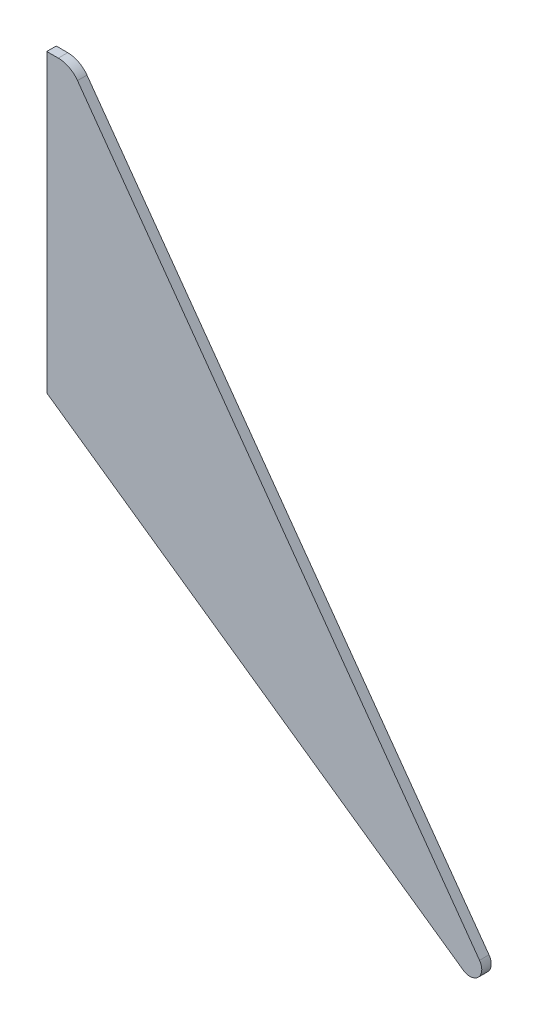
ISO-10303-21;
HEADER;
FILE_DESCRIPTION(('STEP AP214'),'2;1');
FILE_NAME('part.step','',(''),(''),'','','');
FILE_SCHEMA(('AUTOMOTIVE_DESIGN { 1 0 10303 214 1 1 1 1 }'));
ENDSEC;
DATA;
#1=APPLICATION_CONTEXT('core data for automotive mechanical design processes');
#2=APPLICATION_PROTOCOL_DEFINITION('international standard','automotive_design',2000,#1);
#3=PRODUCT_CONTEXT('',#1,'mechanical');
#4=PRODUCT('Part','Part','',(#3));
#5=PRODUCT_RELATED_PRODUCT_CATEGORY('part','',(#4));
#6=PRODUCT_DEFINITION_FORMATION('','',#4);
#7=PRODUCT_DEFINITION_CONTEXT('part definition',#1,'design');
#8=PRODUCT_DEFINITION('design','',#6,#7);
#9=PRODUCT_DEFINITION_SHAPE('','',#8);
#10=(LENGTH_UNIT() NAMED_UNIT(*) SI_UNIT(.MILLI.,.METRE.));
#11=(NAMED_UNIT(*) PLANE_ANGLE_UNIT() SI_UNIT($,.RADIAN.));
#12=(NAMED_UNIT(*) SI_UNIT($,.STERADIAN.) SOLID_ANGLE_UNIT());
#13=UNCERTAINTY_MEASURE_WITH_UNIT(LENGTH_MEASURE(1.E-05),#10,'distance_accuracy_value','');
#14=(GEOMETRIC_REPRESENTATION_CONTEXT(3) GLOBAL_UNCERTAINTY_ASSIGNED_CONTEXT((#13)) GLOBAL_UNIT_ASSIGNED_CONTEXT((#10,
#11,#12)) REPRESENTATION_CONTEXT('',''));
#15=CARTESIAN_POINT('',(0.,0.,0.));
#16=DIRECTION('',(0.,0.,1.));
#17=DIRECTION('',(1.,0.,0.));
#18=AXIS2_PLACEMENT_3D('',#15,#16,#17);
#19=CARTESIAN_POINT('',(200.,-140.041507641943,4.));
#20=DIRECTION('',(0.57357643635105,0.819152044288989,0.));
#21=DIRECTION('',(-0.819152044288989,0.57357643635105,0.));
#22=AXIS2_PLACEMENT_3D('',#19,#20,#21);
#23=PLANE('',#22);
#24=DIRECTION('',(0.819152044288989,-0.57357643635105,0.));
#25=VECTOR('',#24,1.);
#26=CARTESIAN_POINT('',(200.,-140.041507641943,0.));
#27=LINE('',#26,#25);
#28=CARTESIAN_POINT('',(0.,0.,0.));
#29=VERTEX_POINT('',#28);
#30=CARTESIAN_POINT('',(175.993963400645,-123.232299852536,0.));
#31=VERTEX_POINT('',#30);
#32=EDGE_CURVE('E130',#29,#31,#27,.T.);
#33=ORIENTED_EDGE('',*,*,#32,.T.);
#34=DIRECTION('',(0.,0.,-1.));
#35=VECTOR('',#34,1.);
#36=CARTESIAN_POINT('',(175.993963400645,-123.232299852536,4.));
#37=LINE('',#36,#35);
#38=CARTESIAN_POINT('',(175.993963400645,-123.232299852536,4.));
#39=VERTEX_POINT('',#38);
#40=EDGE_CURVE('E149',#31,#39,#37,.F.);
#41=ORIENTED_EDGE('',*,*,#40,.T.);
#42=DIRECTION('',(0.819152044288989,-0.57357643635105,0.));
#43=VECTOR('',#42,1.);
#44=CARTESIAN_POINT('',(200.,-140.041507641943,4.));
#45=LINE('',#44,#43);
#46=CARTESIAN_POINT('',(0.,0.,4.));
#47=VERTEX_POINT('',#46);
#48=EDGE_CURVE('E141',#47,#39,#45,.T.);
#49=ORIENTED_EDGE('',*,*,#48,.F.);
#50=DIRECTION('',(0.,0.,-1.));
#51=VECTOR('',#50,1.);
#52=CARTESIAN_POINT('',(0.,0.,4.));
#53=LINE('',#52,#51);
#54=EDGE_CURVE('E118',#47,#29,#53,.T.);
#55=ORIENTED_EDGE('',*,*,#54,.T.);
#56=EDGE_LOOP('',(#33,#41,#49,#55));
#57=FACE_BOUND('',#56,.T.);
#58=ADVANCED_FACE('F43',(#57),#23,.F.);
#59=CARTESIAN_POINT('',(10.,125.,4.));
#60=DIRECTION('',(-0.812739317895451,-0.58262749776065,0.));
#61=DIRECTION('',(0.58262749776065,-0.812739317895451,0.));
#62=AXIS2_PLACEMENT_3D('',#59,#60,#61);
#63=PLANE('',#62);
#64=DIRECTION('',(-0.58262749776065,0.812739317895451,0.));
#65=VECTOR('',#64,1.);
#66=CARTESIAN_POINT('',(10.,125.,0.));
#67=LINE('',#66,#65);
#68=CARTESIAN_POINT('',(182.925542171877,-116.223402142288,0.));
#69=VERTEX_POINT('',#68);
#70=CARTESIAN_POINT('',(12.9920134446491,120.826274977607,0.));
#71=VERTEX_POINT('',#70);
#72=EDGE_CURVE('E134',#69,#71,#67,.T.);
#73=ORIENTED_EDGE('',*,*,#72,.T.);
#74=DIRECTION('',(0.,0.,-1.));
#75=VECTOR('',#74,1.);
#76=CARTESIAN_POINT('',(12.9920134446491,120.826274977607,4.));
#77=LINE('',#76,#75);
#78=CARTESIAN_POINT('',(12.9920134446491,120.826274977607,4.));
#79=VERTEX_POINT('',#78);
#80=EDGE_CURVE('E52',#71,#79,#77,.F.);
#81=ORIENTED_EDGE('',*,*,#80,.T.);
#82=DIRECTION('',(-0.58262749776065,0.812739317895451,0.));
#83=VECTOR('',#82,1.);
#84=CARTESIAN_POINT('',(10.,125.,4.));
#85=LINE('',#84,#83);
#86=CARTESIAN_POINT('',(182.925542171877,-116.223402142288,4.));
#87=VERTEX_POINT('',#86);
#88=EDGE_CURVE('E108',#87,#79,#85,.T.);
#89=ORIENTED_EDGE('',*,*,#88,.F.);
#90=DIRECTION('',(0.,0.,-1.));
#91=VECTOR('',#90,1.);
#92=CARTESIAN_POINT('',(182.925542171877,-116.223402142288,4.));
#93=LINE('',#92,#91);
#94=EDGE_CURVE('E117',#87,#69,#93,.T.);
#95=ORIENTED_EDGE('',*,*,#94,.T.);
#96=EDGE_LOOP('',(#73,#81,#89,#95));
#97=FACE_BOUND('',#96,.T.);
#98=ADVANCED_FACE('F190',(#97),#63,.F.);
#99=CARTESIAN_POINT('',(0.,125.,4.));
#100=DIRECTION('',(0.,-1.,0.));
#101=DIRECTION('',(0.,0.,-1.));
#102=AXIS2_PLACEMENT_3D('',#99,#100,#101);
#103=PLANE('',#102);
#104=DIRECTION('',(-1.,0.,0.));
#105=VECTOR('',#104,1.);
#106=CARTESIAN_POINT('',(0.,125.,4.));
#107=LINE('',#106,#105);
#108=CARTESIAN_POINT('',(4.8646202656946,125.,4.));
#109=VERTEX_POINT('',#108);
#110=CARTESIAN_POINT('',(0.,125.,4.));
#111=VERTEX_POINT('',#110);
#112=EDGE_CURVE('E96',#109,#111,#107,.T.);
#113=ORIENTED_EDGE('',*,*,#112,.F.);
#114=DIRECTION('',(0.,0.,-1.));
#115=VECTOR('',#114,1.);
#116=CARTESIAN_POINT('',(4.8646202656946,125.,4.));
#117=LINE('',#116,#115);
#118=CARTESIAN_POINT('',(4.8646202656946,125.,0.));
#119=VERTEX_POINT('',#118);
#120=EDGE_CURVE('E155',#109,#119,#117,.T.);
#121=ORIENTED_EDGE('',*,*,#120,.T.);
#122=DIRECTION('',(-1.,0.,0.));
#123=VECTOR('',#122,1.);
#124=CARTESIAN_POINT('',(0.,125.,0.));
#125=LINE('',#124,#123);
#126=CARTESIAN_POINT('',(0.,125.,0.));
#127=VERTEX_POINT('',#126);
#128=EDGE_CURVE('E113',#119,#127,#125,.T.);
#129=ORIENTED_EDGE('',*,*,#128,.T.);
#130=DIRECTION('',(0.,0.,-1.));
#131=VECTOR('',#130,1.);
#132=CARTESIAN_POINT('',(0.,125.,4.));
#133=LINE('',#132,#131);
#134=EDGE_CURVE('E111',#111,#127,#133,.T.);
#135=ORIENTED_EDGE('',*,*,#134,.F.);
#136=EDGE_LOOP('',(#113,#121,#129,#135));
#137=FACE_BOUND('',#136,.T.);
#138=ADVANCED_FACE('F112',(#137),#103,.F.);
#139=CARTESIAN_POINT('',(0.,0.,4.));
#140=DIRECTION('',(1.,0.,0.));
#141=DIRECTION('',(0.,0.,-1.));
#142=AXIS2_PLACEMENT_3D('',#139,#140,#141);
#143=PLANE('',#142);
#144=DIRECTION('',(0.,-1.,0.));
#145=VECTOR('',#144,1.);
#146=CARTESIAN_POINT('',(0.,0.,0.));
#147=LINE('',#146,#145);
#148=EDGE_CURVE('E139',#127,#29,#147,.T.);
#149=ORIENTED_EDGE('',*,*,#148,.T.);
#150=ORIENTED_EDGE('',*,*,#54,.F.);
#151=DIRECTION('',(0.,-1.,0.));
#152=VECTOR('',#151,1.);
#153=CARTESIAN_POINT('',(0.,0.,4.));
#154=LINE('',#153,#152);
#155=EDGE_CURVE('E101',#111,#47,#154,.T.);
#156=ORIENTED_EDGE('',*,*,#155,.F.);
#157=ORIENTED_EDGE('',*,*,#134,.T.);
#158=EDGE_LOOP('',(#149,#150,#156,#157));
#159=FACE_BOUND('',#158,.T.);
#160=ADVANCED_FACE('F120',(#159),#143,.F.);
#161=CARTESIAN_POINT('',(0.,0.,4.));
#162=DIRECTION('',(0.,0.,-1.));
#163=DIRECTION('',(-1.,0.,0.));
#164=AXIS2_PLACEMENT_3D('',#161,#162,#163);
#165=PLANE('',#164);
#166=ORIENTED_EDGE('',*,*,#88,.T.);
#167=CARTESIAN_POINT('',(4.8646202656946,115.,4.));
#168=DIRECTION('',(0.,0.,-1.));
#169=DIRECTION('',(-1.,0.,0.));
#170=AXIS2_PLACEMENT_3D('',#167,#168,#169);
#171=CIRCLE('',#170,10.);
#172=EDGE_CURVE('E11',#79,#109,#171,.F.);
#173=ORIENTED_EDGE('',*,*,#172,.T.);
#174=ORIENTED_EDGE('',*,*,#112,.T.);
#175=ORIENTED_EDGE('',*,*,#155,.T.);
#176=ORIENTED_EDGE('',*,*,#48,.T.);
#177=CARTESIAN_POINT('',(178.8618455824,-119.136539631091,4.));
#178=DIRECTION('',(0.,0.,-1.));
#179=DIRECTION('',(-1.,0.,0.));
#180=AXIS2_PLACEMENT_3D('',#177,#178,#179);
#181=CIRCLE('',#180,5.);
#182=EDGE_CURVE('E152',#39,#87,#181,.F.);
#183=ORIENTED_EDGE('',*,*,#182,.T.);
#184=EDGE_LOOP('',(#166,#173,#174,#175,#176,#183));
#185=FACE_BOUND('',#184,.T.);
#186=ADVANCED_FACE('F98',(#185),#165,.F.);
#187=CARTESIAN_POINT('',(0.,0.,0.));
#188=DIRECTION('',(0.,0.,-1.));
#189=DIRECTION('',(-1.,0.,0.));
#190=AXIS2_PLACEMENT_3D('',#187,#188,#189);
#191=PLANE('',#190);
#192=ORIENTED_EDGE('',*,*,#128,.F.);
#193=CARTESIAN_POINT('',(4.8646202656946,115.,0.));
#194=DIRECTION('',(0.,0.,-1.));
#195=DIRECTION('',(-1.,0.,0.));
#196=AXIS2_PLACEMENT_3D('',#193,#194,#195);
#197=CIRCLE('',#196,10.);
#198=EDGE_CURVE('E66',#119,#71,#197,.T.);
#199=ORIENTED_EDGE('',*,*,#198,.T.);
#200=ORIENTED_EDGE('',*,*,#72,.F.);
#201=CARTESIAN_POINT('',(178.8618455824,-119.136539631091,0.));
#202=DIRECTION('',(0.,0.,-1.));
#203=DIRECTION('',(-1.,0.,0.));
#204=AXIS2_PLACEMENT_3D('',#201,#202,#203);
#205=CIRCLE('',#204,5.);
#206=EDGE_CURVE('E146',#69,#31,#205,.T.);
#207=ORIENTED_EDGE('',*,*,#206,.T.);
#208=ORIENTED_EDGE('',*,*,#32,.F.);
#209=ORIENTED_EDGE('',*,*,#148,.F.);
#210=EDGE_LOOP('',(#192,#199,#200,#207,#208,#209));
#211=FACE_BOUND('',#210,.T.);
#212=ADVANCED_FACE('F171',(#211),#191,.T.);
#213=CARTESIAN_POINT('',(178.8618455824,-119.136539631091,4.));
#214=DIRECTION('',(0.,0.,-1.));
#215=DIRECTION('',(-1.,0.,0.));
#216=AXIS2_PLACEMENT_3D('',#213,#214,#215);
#217=CYLINDRICAL_SURFACE('',#216,5.);
#218=ORIENTED_EDGE('',*,*,#182,.F.);
#219=ORIENTED_EDGE('',*,*,#40,.F.);
#220=ORIENTED_EDGE('',*,*,#206,.F.);
#221=ORIENTED_EDGE('',*,*,#94,.F.);
#222=EDGE_LOOP('',(#218,#219,#220,#221));
#223=FACE_BOUND('',#222,.T.);
#224=ADVANCED_FACE('F183',(#223),#217,.T.);
#225=CARTESIAN_POINT('',(4.8646202656946,115.,4.));
#226=DIRECTION('',(0.,0.,-1.));
#227=DIRECTION('',(-1.,0.,0.));
#228=AXIS2_PLACEMENT_3D('',#225,#226,#227);
#229=CYLINDRICAL_SURFACE('',#228,10.);
#230=ORIENTED_EDGE('',*,*,#172,.F.);
#231=ORIENTED_EDGE('',*,*,#80,.F.);
#232=ORIENTED_EDGE('',*,*,#198,.F.);
#233=ORIENTED_EDGE('',*,*,#120,.F.);
#234=EDGE_LOOP('',(#230,#231,#232,#233));
#235=FACE_BOUND('',#234,.T.);
#236=ADVANCED_FACE('F45',(#235),#229,.T.);
#237=CLOSED_SHELL('',(#58,#98,#138,#160,#186,#212,#224,#236));
#238=MANIFOLD_SOLID_BREP('B2',#237);
#239=ADVANCED_BREP_SHAPE_REPRESENTATION('',(#18,#238),#14);
#240=SHAPE_DEFINITION_REPRESENTATION(#9,#239);
ENDSEC;
END-ISO-10303-21;
